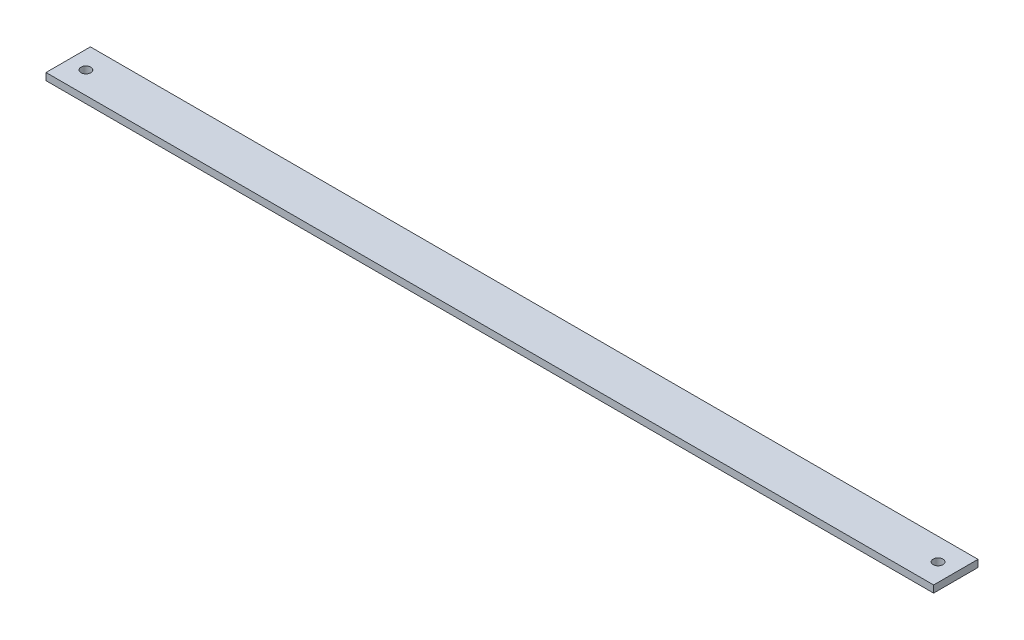
ISO-10303-21;
HEADER;
FILE_DESCRIPTION(('STEP AP214'),'2;1');
FILE_NAME('part.step','',(''),(''),'','','');
FILE_SCHEMA(('AUTOMOTIVE_DESIGN { 1 0 10303 214 1 1 1 1 }'));
ENDSEC;
DATA;
#1=APPLICATION_CONTEXT('core data for automotive mechanical design processes');
#2=APPLICATION_PROTOCOL_DEFINITION('international standard','automotive_design',2000,#1);
#3=PRODUCT_CONTEXT('',#1,'mechanical');
#4=PRODUCT('Part','Part','',(#3));
#5=PRODUCT_RELATED_PRODUCT_CATEGORY('part','',(#4));
#6=PRODUCT_DEFINITION_FORMATION('','',#4);
#7=PRODUCT_DEFINITION_CONTEXT('part definition',#1,'design');
#8=PRODUCT_DEFINITION('design','',#6,#7);
#9=PRODUCT_DEFINITION_SHAPE('','',#8);
#10=(LENGTH_UNIT() NAMED_UNIT(*) SI_UNIT(.MILLI.,.METRE.));
#11=(NAMED_UNIT(*) PLANE_ANGLE_UNIT() SI_UNIT($,.RADIAN.));
#12=(NAMED_UNIT(*) SI_UNIT($,.STERADIAN.) SOLID_ANGLE_UNIT());
#13=UNCERTAINTY_MEASURE_WITH_UNIT(LENGTH_MEASURE(1.E-05),#10,'distance_accuracy_value','');
#14=(GEOMETRIC_REPRESENTATION_CONTEXT(3) GLOBAL_UNCERTAINTY_ASSIGNED_CONTEXT((#13)) GLOBAL_UNIT_ASSIGNED_CONTEXT((#10,
#11,#12)) REPRESENTATION_CONTEXT('',''));
#15=CARTESIAN_POINT('',(0.,0.,0.));
#16=DIRECTION('',(0.,0.,1.));
#17=DIRECTION('',(1.,0.,0.));
#18=AXIS2_PLACEMENT_3D('',#15,#16,#17);
#19=CARTESIAN_POINT('',(250.,2.,-12.5));
#20=DIRECTION('',(0.,0.,1.));
#21=DIRECTION('',(1.,0.,0.));
#22=AXIS2_PLACEMENT_3D('',#19,#20,#21);
#23=PLANE('',#22);
#24=DIRECTION('',(0.,1.,0.));
#25=VECTOR('',#24,1.);
#26=CARTESIAN_POINT('',(-250.,2.,-12.5));
#27=LINE('',#26,#25);
#28=CARTESIAN_POINT('',(-250.,-2.,-12.5));
#29=VERTEX_POINT('',#28);
#30=CARTESIAN_POINT('',(-250.,2.,-12.5));
#31=VERTEX_POINT('',#30);
#32=EDGE_CURVE('E96',#29,#31,#27,.T.);
#33=ORIENTED_EDGE('',*,*,#32,.T.);
#34=DIRECTION('',(-1.,0.,0.));
#35=VECTOR('',#34,1.);
#36=CARTESIAN_POINT('',(250.,2.,-12.5));
#37=LINE('',#36,#35);
#38=CARTESIAN_POINT('',(250.,2.,-12.5));
#39=VERTEX_POINT('',#38);
#40=EDGE_CURVE('E11',#39,#31,#37,.T.);
#41=ORIENTED_EDGE('',*,*,#40,.F.);
#42=DIRECTION('',(0.,1.,0.));
#43=VECTOR('',#42,1.);
#44=CARTESIAN_POINT('',(250.,2.,-12.5));
#45=LINE('',#44,#43);
#46=CARTESIAN_POINT('',(250.,-2.,-12.5));
#47=VERTEX_POINT('',#46);
#48=EDGE_CURVE('E84',#47,#39,#45,.T.);
#49=ORIENTED_EDGE('',*,*,#48,.F.);
#50=DIRECTION('',(-1.,0.,0.));
#51=VECTOR('',#50,1.);
#52=CARTESIAN_POINT('',(250.,-2.,-12.5));
#53=LINE('',#52,#51);
#54=EDGE_CURVE('E92',#47,#29,#53,.T.);
#55=ORIENTED_EDGE('',*,*,#54,.T.);
#56=EDGE_LOOP('',(#33,#41,#49,#55));
#57=FACE_BOUND('',#56,.T.);
#58=ADVANCED_FACE('F33',(#57),#23,.F.);
#59=CARTESIAN_POINT('',(250.,2.,12.5));
#60=DIRECTION('',(0.,-1.,0.));
#61=DIRECTION('',(0.,0.,-1.));
#62=AXIS2_PLACEMENT_3D('',#59,#60,#61);
#63=PLANE('',#62);
#64=CARTESIAN_POINT('',(-240.,2.,0.));
#65=DIRECTION('',(0.,1.,0.));
#66=DIRECTION('',(0.,0.,1.));
#67=AXIS2_PLACEMENT_3D('',#64,#65,#66);
#68=CIRCLE('',#67,2.75000000000001);
#69=CARTESIAN_POINT('',(-240.,2.,2.75000000000001));
#70=VERTEX_POINT('',#69);
#71=EDGE_CURVE('E116',#70,#70,#68,.T.);
#72=ORIENTED_EDGE('',*,*,#71,.F.);
#73=EDGE_LOOP('',(#72));
#74=FACE_BOUND('',#73,.T.);
#75=CARTESIAN_POINT('',(240.,2.,0.));
#76=DIRECTION('',(0.,1.,0.));
#77=DIRECTION('',(0.,0.,-1.));
#78=AXIS2_PLACEMENT_3D('',#75,#76,#77);
#79=CIRCLE('',#78,2.75000000000001);
#80=CARTESIAN_POINT('',(240.,2.,-2.75000000000001));
#81=VERTEX_POINT('',#80);
#82=EDGE_CURVE('E110',#81,#81,#79,.T.);
#83=ORIENTED_EDGE('',*,*,#82,.F.);
#84=EDGE_LOOP('',(#83));
#85=FACE_BOUND('',#84,.T.);
#86=DIRECTION('',(0.,0.,1.));
#87=VECTOR('',#86,1.);
#88=CARTESIAN_POINT('',(-250.,2.,12.5));
#89=LINE('',#88,#87);
#90=CARTESIAN_POINT('',(-250.,2.,12.5));
#91=VERTEX_POINT('',#90);
#92=EDGE_CURVE('E88',#31,#91,#89,.T.);
#93=ORIENTED_EDGE('',*,*,#92,.T.);
#94=DIRECTION('',(-1.,0.,0.));
#95=VECTOR('',#94,1.);
#96=CARTESIAN_POINT('',(250.,2.,12.5));
#97=LINE('',#96,#95);
#98=CARTESIAN_POINT('',(250.,2.,12.5));
#99=VERTEX_POINT('',#98);
#100=EDGE_CURVE('E41',#99,#91,#97,.T.);
#101=ORIENTED_EDGE('',*,*,#100,.F.);
#102=DIRECTION('',(0.,0.,1.));
#103=VECTOR('',#102,1.);
#104=CARTESIAN_POINT('',(250.,2.,12.5));
#105=LINE('',#104,#103);
#106=EDGE_CURVE('E79',#39,#99,#105,.T.);
#107=ORIENTED_EDGE('',*,*,#106,.F.);
#108=ORIENTED_EDGE('',*,*,#40,.T.);
#109=EDGE_LOOP('',(#93,#101,#107,#108));
#110=FACE_BOUND('',#109,.T.);
#111=ADVANCED_FACE('F87',(#74,#85,#110),#63,.F.);
#112=CARTESIAN_POINT('',(250.,2.,12.5));
#113=DIRECTION('',(0.,0.,-1.));
#114=DIRECTION('',(-1.,0.,0.));
#115=AXIS2_PLACEMENT_3D('',#112,#113,#114);
#116=PLANE('',#115);
#117=DIRECTION('',(0.,-1.,0.));
#118=VECTOR('',#117,1.);
#119=CARTESIAN_POINT('',(-250.,2.,12.5));
#120=LINE('',#119,#118);
#121=CARTESIAN_POINT('',(-250.,-2.,12.5));
#122=VERTEX_POINT('',#121);
#123=EDGE_CURVE('E66',#91,#122,#120,.T.);
#124=ORIENTED_EDGE('',*,*,#123,.T.);
#125=DIRECTION('',(-1.,0.,0.));
#126=VECTOR('',#125,1.);
#127=CARTESIAN_POINT('',(250.,-2.,12.5));
#128=LINE('',#127,#126);
#129=CARTESIAN_POINT('',(250.,-2.,12.5));
#130=VERTEX_POINT('',#129);
#131=EDGE_CURVE('E89',#130,#122,#128,.T.);
#132=ORIENTED_EDGE('',*,*,#131,.F.);
#133=DIRECTION('',(0.,-1.,0.));
#134=VECTOR('',#133,1.);
#135=CARTESIAN_POINT('',(250.,2.,12.5));
#136=LINE('',#135,#134);
#137=EDGE_CURVE('E82',#99,#130,#136,.T.);
#138=ORIENTED_EDGE('',*,*,#137,.F.);
#139=ORIENTED_EDGE('',*,*,#100,.T.);
#140=EDGE_LOOP('',(#124,#132,#138,#139));
#141=FACE_BOUND('',#140,.T.);
#142=ADVANCED_FACE('F90',(#141),#116,.F.);
#143=CARTESIAN_POINT('',(250.,-2.,12.5));
#144=DIRECTION('',(0.,1.,0.));
#145=DIRECTION('',(0.,0.,1.));
#146=AXIS2_PLACEMENT_3D('',#143,#144,#145);
#147=PLANE('',#146);
#148=CARTESIAN_POINT('',(-240.,-2.,0.));
#149=DIRECTION('',(0.,1.,0.));
#150=DIRECTION('',(0.,0.,1.));
#151=AXIS2_PLACEMENT_3D('',#148,#149,#150);
#152=CIRCLE('',#151,2.75000000000001);
#153=CARTESIAN_POINT('',(-240.,-2.,2.75000000000001));
#154=VERTEX_POINT('',#153);
#155=EDGE_CURVE('E99',#154,#154,#152,.T.);
#156=ORIENTED_EDGE('',*,*,#155,.T.);
#157=EDGE_LOOP('',(#156));
#158=FACE_BOUND('',#157,.T.);
#159=CARTESIAN_POINT('',(240.,-2.,0.));
#160=DIRECTION('',(0.,1.,0.));
#161=DIRECTION('',(0.,0.,-1.));
#162=AXIS2_PLACEMENT_3D('',#159,#160,#161);
#163=CIRCLE('',#162,2.75000000000001);
#164=CARTESIAN_POINT('',(240.,-2.,-2.75000000000001));
#165=VERTEX_POINT('',#164);
#166=EDGE_CURVE('E113',#165,#165,#163,.T.);
#167=ORIENTED_EDGE('',*,*,#166,.T.);
#168=EDGE_LOOP('',(#167));
#169=FACE_BOUND('',#168,.T.);
#170=DIRECTION('',(0.,0.,-1.));
#171=VECTOR('',#170,1.);
#172=CARTESIAN_POINT('',(-250.,-2.,12.5));
#173=LINE('',#172,#171);
#174=EDGE_CURVE('E72',#122,#29,#173,.T.);
#175=ORIENTED_EDGE('',*,*,#174,.T.);
#176=ORIENTED_EDGE('',*,*,#54,.F.);
#177=DIRECTION('',(0.,0.,-1.));
#178=VECTOR('',#177,1.);
#179=CARTESIAN_POINT('',(250.,-2.,12.5));
#180=LINE('',#179,#178);
#181=EDGE_CURVE('E49',#130,#47,#180,.T.);
#182=ORIENTED_EDGE('',*,*,#181,.F.);
#183=ORIENTED_EDGE('',*,*,#131,.T.);
#184=EDGE_LOOP('',(#175,#176,#182,#183));
#185=FACE_BOUND('',#184,.T.);
#186=ADVANCED_FACE('F104',(#158,#169,#185),#147,.F.);
#187=CARTESIAN_POINT('',(250.,0.,0.));
#188=DIRECTION('',(1.,0.,0.));
#189=DIRECTION('',(0.,0.,-1.));
#190=AXIS2_PLACEMENT_3D('',#187,#188,#189);
#191=PLANE('',#190);
#192=ORIENTED_EDGE('',*,*,#48,.T.);
#193=ORIENTED_EDGE('',*,*,#106,.T.);
#194=ORIENTED_EDGE('',*,*,#137,.T.);
#195=ORIENTED_EDGE('',*,*,#181,.T.);
#196=EDGE_LOOP('',(#192,#193,#194,#195));
#197=FACE_BOUND('',#196,.T.);
#198=ADVANCED_FACE('F80',(#197),#191,.T.);
#199=CARTESIAN_POINT('',(-250.,0.,0.));
#200=DIRECTION('',(1.,0.,0.));
#201=DIRECTION('',(0.,0.,-1.));
#202=AXIS2_PLACEMENT_3D('',#199,#200,#201);
#203=PLANE('',#202);
#204=ORIENTED_EDGE('',*,*,#32,.F.);
#205=ORIENTED_EDGE('',*,*,#174,.F.);
#206=ORIENTED_EDGE('',*,*,#123,.F.);
#207=ORIENTED_EDGE('',*,*,#92,.F.);
#208=EDGE_LOOP('',(#204,#205,#206,#207));
#209=FACE_BOUND('',#208,.T.);
#210=ADVANCED_FACE('F107',(#209),#203,.F.);
#211=CARTESIAN_POINT('',(240.,-2.,0.));
#212=DIRECTION('',(0.,1.,0.));
#213=DIRECTION('',(0.,0.,1.));
#214=AXIS2_PLACEMENT_3D('',#211,#212,#213);
#215=CYLINDRICAL_SURFACE('',#214,2.75000000000001);
#216=ORIENTED_EDGE('',*,*,#166,.F.);
#217=EDGE_LOOP('',(#216));
#218=FACE_BOUND('',#217,.T.);
#219=ORIENTED_EDGE('',*,*,#82,.T.);
#220=EDGE_LOOP('',(#219));
#221=FACE_BOUND('',#220,.T.);
#222=ADVANCED_FACE('F127',(#218,#221),#215,.F.);
#223=CARTESIAN_POINT('',(-240.,-2.,0.));
#224=DIRECTION('',(0.,1.,0.));
#225=DIRECTION('',(0.,0.,1.));
#226=AXIS2_PLACEMENT_3D('',#223,#224,#225);
#227=CYLINDRICAL_SURFACE('',#226,2.75000000000001);
#228=ORIENTED_EDGE('',*,*,#155,.F.);
#229=EDGE_LOOP('',(#228));
#230=FACE_BOUND('',#229,.T.);
#231=ORIENTED_EDGE('',*,*,#71,.T.);
#232=EDGE_LOOP('',(#231));
#233=FACE_BOUND('',#232,.T.);
#234=ADVANCED_FACE('F124',(#230,#233),#227,.F.);
#235=CLOSED_SHELL('',(#58,#111,#142,#186,#198,#210,#222,#234));
#236=MANIFOLD_SOLID_BREP('B2',#235);
#237=ADVANCED_BREP_SHAPE_REPRESENTATION('',(#18,#236),#14);
#238=SHAPE_DEFINITION_REPRESENTATION(#9,#237);
ENDSEC;
END-ISO-10303-21;
